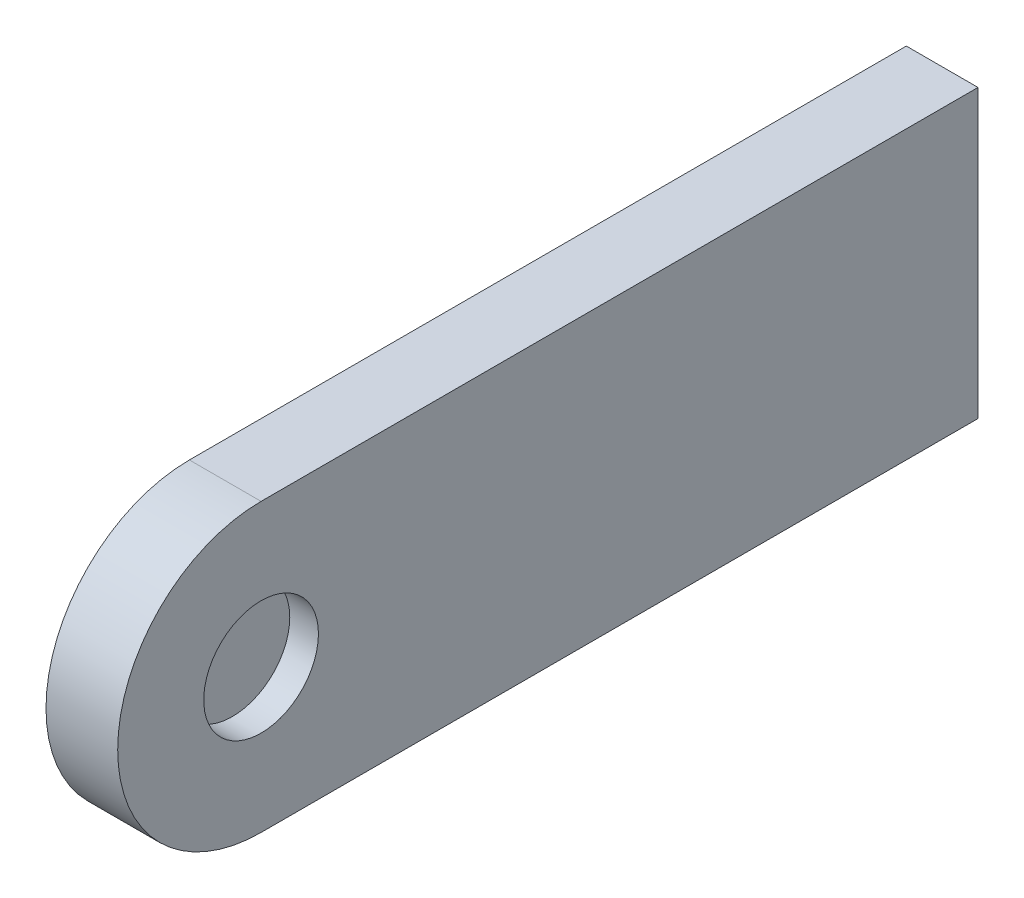
ISO-10303-21;
HEADER;
FILE_DESCRIPTION(('STEP AP214'),'2;1');
FILE_NAME('part.step','',(''),(''),'','','');
FILE_SCHEMA(('AUTOMOTIVE_DESIGN { 1 0 10303 214 1 1 1 1 }'));
ENDSEC;
DATA;
#1=APPLICATION_CONTEXT('core data for automotive mechanical design processes');
#2=APPLICATION_PROTOCOL_DEFINITION('international standard','automotive_design',2000,#1);
#3=PRODUCT_CONTEXT('',#1,'mechanical');
#4=PRODUCT('Part','Part','',(#3));
#5=PRODUCT_RELATED_PRODUCT_CATEGORY('part','',(#4));
#6=PRODUCT_DEFINITION_FORMATION('','',#4);
#7=PRODUCT_DEFINITION_CONTEXT('part definition',#1,'design');
#8=PRODUCT_DEFINITION('design','',#6,#7);
#9=PRODUCT_DEFINITION_SHAPE('','',#8);
#10=(LENGTH_UNIT() NAMED_UNIT(*) SI_UNIT(.MILLI.,.METRE.));
#11=(NAMED_UNIT(*) PLANE_ANGLE_UNIT() SI_UNIT($,.RADIAN.));
#12=(NAMED_UNIT(*) SI_UNIT($,.STERADIAN.) SOLID_ANGLE_UNIT());
#13=UNCERTAINTY_MEASURE_WITH_UNIT(LENGTH_MEASURE(1.E-05),#10,'distance_accuracy_value','');
#14=(GEOMETRIC_REPRESENTATION_CONTEXT(3) GLOBAL_UNCERTAINTY_ASSIGNED_CONTEXT((#13)) GLOBAL_UNIT_ASSIGNED_CONTEXT((#10,
#11,#12)) REPRESENTATION_CONTEXT('',''));
#15=CARTESIAN_POINT('',(0.,0.,0.));
#16=DIRECTION('',(0.,0.,1.));
#17=DIRECTION('',(1.,0.,0.));
#18=AXIS2_PLACEMENT_3D('',#15,#16,#17);
#19=CARTESIAN_POINT('',(5.,10.,-25.));
#20=DIRECTION('',(0.,0.,1.));
#21=DIRECTION('',(1.,0.,0.));
#22=AXIS2_PLACEMENT_3D('',#19,#20,#21);
#23=PLANE('',#22);
#24=DIRECTION('',(0.,1.,0.));
#25=VECTOR('',#24,1.);
#26=CARTESIAN_POINT('',(0.,10.,-25.));
#27=LINE('',#26,#25);
#28=CARTESIAN_POINT('',(0.,-10.,-25.));
#29=VERTEX_POINT('',#28);
#30=CARTESIAN_POINT('',(0.,10.,-25.));
#31=VERTEX_POINT('',#30);
#32=EDGE_CURVE('E96',#29,#31,#27,.T.);
#33=ORIENTED_EDGE('',*,*,#32,.T.);
#34=DIRECTION('',(-1.,0.,0.));
#35=VECTOR('',#34,1.);
#36=CARTESIAN_POINT('',(5.,10.,-25.));
#37=LINE('',#36,#35);
#38=CARTESIAN_POINT('',(5.,10.,-25.));
#39=VERTEX_POINT('',#38);
#40=EDGE_CURVE('E11',#39,#31,#37,.T.);
#41=ORIENTED_EDGE('',*,*,#40,.F.);
#42=DIRECTION('',(0.,1.,0.));
#43=VECTOR('',#42,1.);
#44=CARTESIAN_POINT('',(5.,10.,-25.));
#45=LINE('',#44,#43);
#46=CARTESIAN_POINT('',(5.,-10.,-25.));
#47=VERTEX_POINT('',#46);
#48=EDGE_CURVE('E84',#47,#39,#45,.T.);
#49=ORIENTED_EDGE('',*,*,#48,.F.);
#50=DIRECTION('',(-1.,0.,0.));
#51=VECTOR('',#50,1.);
#52=CARTESIAN_POINT('',(5.,-10.,-25.));
#53=LINE('',#52,#51);
#54=EDGE_CURVE('E92',#47,#29,#53,.T.);
#55=ORIENTED_EDGE('',*,*,#54,.T.);
#56=EDGE_LOOP('',(#33,#41,#49,#55));
#57=FACE_BOUND('',#56,.T.);
#58=ADVANCED_FACE('F33',(#57),#23,.F.);
#59=CARTESIAN_POINT('',(5.,10.,25.));
#60=DIRECTION('',(0.,-1.,0.));
#61=DIRECTION('',(0.,0.,-1.));
#62=AXIS2_PLACEMENT_3D('',#59,#60,#61);
#63=PLANE('',#62);
#64=DIRECTION('',(0.,0.,1.));
#65=VECTOR('',#64,1.);
#66=CARTESIAN_POINT('',(0.,10.,25.));
#67=LINE('',#66,#65);
#68=CARTESIAN_POINT('',(0.,10.,25.));
#69=VERTEX_POINT('',#68);
#70=EDGE_CURVE('E88',#31,#69,#67,.T.);
#71=ORIENTED_EDGE('',*,*,#70,.T.);
#72=DIRECTION('',(-1.,0.,0.));
#73=VECTOR('',#72,1.);
#74=CARTESIAN_POINT('',(5.,10.,25.));
#75=LINE('',#74,#73);
#76=CARTESIAN_POINT('',(5.,10.,25.));
#77=VERTEX_POINT('',#76);
#78=EDGE_CURVE('E41',#77,#69,#75,.T.);
#79=ORIENTED_EDGE('',*,*,#78,.F.);
#80=DIRECTION('',(0.,0.,1.));
#81=VECTOR('',#80,1.);
#82=CARTESIAN_POINT('',(5.,10.,25.));
#83=LINE('',#82,#81);
#84=EDGE_CURVE('E79',#39,#77,#83,.T.);
#85=ORIENTED_EDGE('',*,*,#84,.F.);
#86=ORIENTED_EDGE('',*,*,#40,.T.);
#87=EDGE_LOOP('',(#71,#79,#85,#86));
#88=FACE_BOUND('',#87,.T.);
#89=ADVANCED_FACE('F87',(#88),#63,.F.);
#90=CARTESIAN_POINT('',(5.,0.,25.));
#91=DIRECTION('',(-1.,0.,0.));
#92=DIRECTION('',(0.,0.,1.));
#93=AXIS2_PLACEMENT_3D('',#90,#91,#92);
#94=CYLINDRICAL_SURFACE('',#93,10.);
#95=CARTESIAN_POINT('',(0.,0.,25.));
#96=DIRECTION('',(1.,0.,0.));
#97=DIRECTION('',(0.,0.,-1.));
#98=AXIS2_PLACEMENT_3D('',#95,#96,#97);
#99=CIRCLE('',#98,10.);
#100=CARTESIAN_POINT('',(0.,-10.,25.));
#101=VERTEX_POINT('',#100);
#102=EDGE_CURVE('E66',#69,#101,#99,.T.);
#103=ORIENTED_EDGE('',*,*,#102,.T.);
#104=DIRECTION('',(-1.,0.,0.));
#105=VECTOR('',#104,1.);
#106=CARTESIAN_POINT('',(5.,-10.,25.));
#107=LINE('',#106,#105);
#108=CARTESIAN_POINT('',(5.,-10.,25.));
#109=VERTEX_POINT('',#108);
#110=EDGE_CURVE('E89',#109,#101,#107,.T.);
#111=ORIENTED_EDGE('',*,*,#110,.F.);
#112=CARTESIAN_POINT('',(5.,0.,25.));
#113=DIRECTION('',(1.,0.,0.));
#114=DIRECTION('',(0.,0.,-1.));
#115=AXIS2_PLACEMENT_3D('',#112,#113,#114);
#116=CIRCLE('',#115,10.);
#117=EDGE_CURVE('E82',#77,#109,#116,.T.);
#118=ORIENTED_EDGE('',*,*,#117,.F.);
#119=ORIENTED_EDGE('',*,*,#78,.T.);
#120=EDGE_LOOP('',(#103,#111,#118,#119));
#121=FACE_BOUND('',#120,.T.);
#122=ADVANCED_FACE('F90',(#121),#94,.T.);
#123=CARTESIAN_POINT('',(5.,-10.,25.));
#124=DIRECTION('',(0.,1.,0.));
#125=DIRECTION('',(0.,0.,1.));
#126=AXIS2_PLACEMENT_3D('',#123,#124,#125);
#127=PLANE('',#126);
#128=DIRECTION('',(0.,0.,-1.));
#129=VECTOR('',#128,1.);
#130=CARTESIAN_POINT('',(0.,-10.,25.));
#131=LINE('',#130,#129);
#132=EDGE_CURVE('E72',#101,#29,#131,.T.);
#133=ORIENTED_EDGE('',*,*,#132,.T.);
#134=ORIENTED_EDGE('',*,*,#54,.F.);
#135=DIRECTION('',(0.,0.,-1.));
#136=VECTOR('',#135,1.);
#137=CARTESIAN_POINT('',(5.,-10.,25.));
#138=LINE('',#137,#136);
#139=EDGE_CURVE('E49',#109,#47,#138,.T.);
#140=ORIENTED_EDGE('',*,*,#139,.F.);
#141=ORIENTED_EDGE('',*,*,#110,.T.);
#142=EDGE_LOOP('',(#133,#134,#140,#141));
#143=FACE_BOUND('',#142,.T.);
#144=ADVANCED_FACE('F104',(#143),#127,.F.);
#145=CARTESIAN_POINT('',(5.,0.,25.));
#146=DIRECTION('',(1.,0.,0.));
#147=DIRECTION('',(0.,0.,-1.));
#148=AXIS2_PLACEMENT_3D('',#145,#146,#147);
#149=PLANE('',#148);
#150=CARTESIAN_POINT('',(5.,0.,25.));
#151=DIRECTION('',(1.,0.,0.));
#152=DIRECTION('',(0.,0.,-1.));
#153=AXIS2_PLACEMENT_3D('',#150,#151,#152);
#154=CIRCLE('',#153,4.);
#155=CARTESIAN_POINT('',(5.,0.,21.));
#156=VERTEX_POINT('',#155);
#157=EDGE_CURVE('E110',#156,#156,#154,.T.);
#158=ORIENTED_EDGE('',*,*,#157,.F.);
#159=EDGE_LOOP('',(#158));
#160=FACE_BOUND('',#159,.T.);
#161=ORIENTED_EDGE('',*,*,#48,.T.);
#162=ORIENTED_EDGE('',*,*,#84,.T.);
#163=ORIENTED_EDGE('',*,*,#117,.T.);
#164=ORIENTED_EDGE('',*,*,#139,.T.);
#165=EDGE_LOOP('',(#161,#162,#163,#164));
#166=FACE_BOUND('',#165,.T.);
#167=ADVANCED_FACE('F80',(#160,#166),#149,.T.);
#168=CARTESIAN_POINT('',(0.,0.,25.));
#169=DIRECTION('',(1.,0.,0.));
#170=DIRECTION('',(0.,0.,-1.));
#171=AXIS2_PLACEMENT_3D('',#168,#169,#170);
#172=PLANE('',#171);
#173=ORIENTED_EDGE('',*,*,#32,.F.);
#174=ORIENTED_EDGE('',*,*,#132,.F.);
#175=ORIENTED_EDGE('',*,*,#102,.F.);
#176=ORIENTED_EDGE('',*,*,#70,.F.);
#177=EDGE_LOOP('',(#173,#174,#175,#176));
#178=FACE_BOUND('',#177,.T.);
#179=ADVANCED_FACE('F107',(#178),#172,.F.);
#180=CARTESIAN_POINT('',(3.,0.,25.));
#181=DIRECTION('',(1.,0.,0.));
#182=DIRECTION('',(0.,0.,-1.));
#183=AXIS2_PLACEMENT_3D('',#180,#181,#182);
#184=CYLINDRICAL_SURFACE('',#183,4.);
#185=CARTESIAN_POINT('',(3.,0.,25.));
#186=DIRECTION('',(1.,0.,0.));
#187=DIRECTION('',(0.,0.,-1.));
#188=AXIS2_PLACEMENT_3D('',#185,#186,#187);
#189=CIRCLE('',#188,4.);
#190=CARTESIAN_POINT('',(3.,0.,21.));
#191=VERTEX_POINT('',#190);
#192=EDGE_CURVE('E99',#191,#191,#189,.T.);
#193=ORIENTED_EDGE('',*,*,#192,.F.);
#194=EDGE_LOOP('',(#193));
#195=FACE_BOUND('',#194,.T.);
#196=ORIENTED_EDGE('',*,*,#157,.T.);
#197=EDGE_LOOP('',(#196));
#198=FACE_BOUND('',#197,.T.);
#199=ADVANCED_FACE('F118',(#195,#198),#184,.F.);
#200=CARTESIAN_POINT('',(3.,0.,0.));
#201=DIRECTION('',(1.,0.,0.));
#202=DIRECTION('',(0.,0.,-1.));
#203=AXIS2_PLACEMENT_3D('',#200,#201,#202);
#204=PLANE('',#203);
#205=ORIENTED_EDGE('',*,*,#192,.T.);
#206=EDGE_LOOP('',(#205));
#207=FACE_BOUND('',#206,.T.);
#208=ADVANCED_FACE('F116',(#207),#204,.T.);
#209=CLOSED_SHELL('',(#58,#89,#122,#144,#167,#179,#199,#208));
#210=MANIFOLD_SOLID_BREP('B2',#209);
#211=ADVANCED_BREP_SHAPE_REPRESENTATION('',(#18,#210),#14);
#212=SHAPE_DEFINITION_REPRESENTATION(#9,#211);
ENDSEC;
END-ISO-10303-21;
